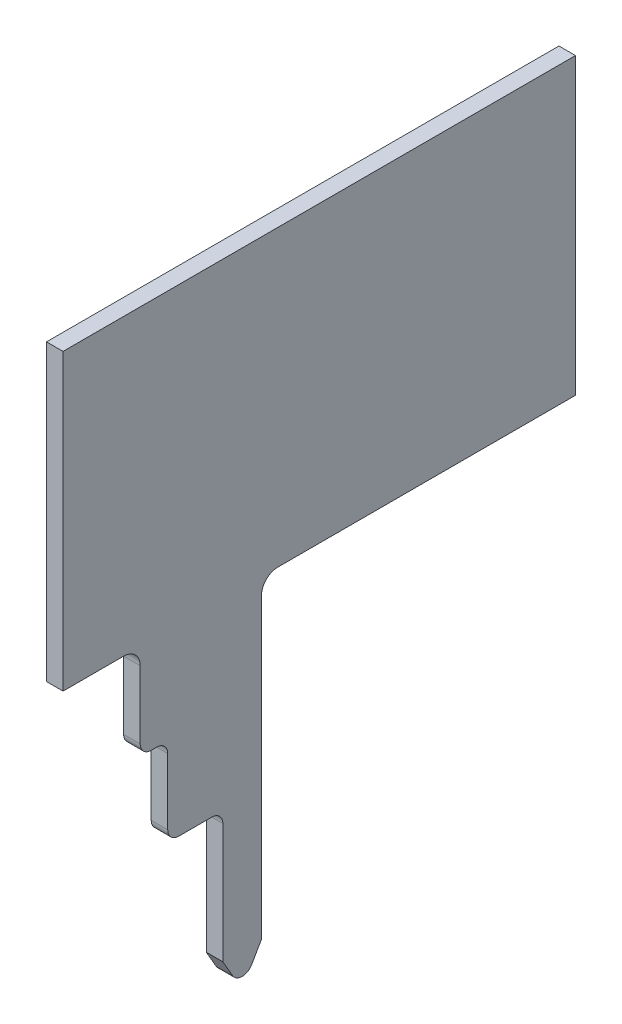
ISO-10303-21;
HEADER;
FILE_DESCRIPTION(('STEP AP214'),'2;1');
FILE_NAME('part.step','',(''),(''),'','','');
FILE_SCHEMA(('AUTOMOTIVE_DESIGN { 1 0 10303 214 1 1 1 1 }'));
ENDSEC;
DATA;
#1=APPLICATION_CONTEXT('core data for automotive mechanical design processes');
#2=APPLICATION_PROTOCOL_DEFINITION('international standard','automotive_design',2000,#1);
#3=PRODUCT_CONTEXT('',#1,'mechanical');
#4=PRODUCT('Part','Part','',(#3));
#5=PRODUCT_RELATED_PRODUCT_CATEGORY('part','',(#4));
#6=PRODUCT_DEFINITION_FORMATION('','',#4);
#7=PRODUCT_DEFINITION_CONTEXT('part definition',#1,'design');
#8=PRODUCT_DEFINITION('design','',#6,#7);
#9=PRODUCT_DEFINITION_SHAPE('','',#8);
#10=(LENGTH_UNIT() NAMED_UNIT(*) SI_UNIT(.MILLI.,.METRE.));
#11=(NAMED_UNIT(*) PLANE_ANGLE_UNIT() SI_UNIT($,.RADIAN.));
#12=(NAMED_UNIT(*) SI_UNIT($,.STERADIAN.) SOLID_ANGLE_UNIT());
#13=UNCERTAINTY_MEASURE_WITH_UNIT(LENGTH_MEASURE(1.E-05),#10,'distance_accuracy_value','');
#14=(GEOMETRIC_REPRESENTATION_CONTEXT(3) GLOBAL_UNCERTAINTY_ASSIGNED_CONTEXT((#13)) GLOBAL_UNIT_ASSIGNED_CONTEXT((#10,
#11,#12)) REPRESENTATION_CONTEXT('',''));
#15=CARTESIAN_POINT('',(0.,0.,0.));
#16=DIRECTION('',(0.,0.,1.));
#17=DIRECTION('',(1.,0.,0.));
#18=AXIS2_PLACEMENT_3D('',#15,#16,#17);
#19=CARTESIAN_POINT('',(0.85,-39.55963411247,-9.486));
#20=DIRECTION('',(-1.,0.,0.));
#21=DIRECTION('',(0.,0.,1.));
#22=AXIS2_PLACEMENT_3D('',#19,#20,#21);
#23=PLANE('',#22);
#24=CARTESIAN_POINT('',(0.85,-35.15,-1.7));
#25=DIRECTION('',(1.,0.,0.));
#26=DIRECTION('',(0.,0.,-1.));
#27=AXIS2_PLACEMENT_3D('',#24,#25,#26);
#28=CIRCLE('',#27,0.2);
#29=CARTESIAN_POINT('',(0.85,-35.15,-1.9));
#30=VERTEX_POINT('',#29);
#31=CARTESIAN_POINT('',(0.85,-34.95,-1.7));
#32=VERTEX_POINT('',#31);
#33=EDGE_CURVE('E250',#30,#32,#28,.T.);
#34=ORIENTED_EDGE('',*,*,#33,.T.);
#35=DIRECTION('',(0.,0.,-1.));
#36=VECTOR('',#35,1.);
#37=CARTESIAN_POINT('',(0.85,-34.95,-1.65));
#38=LINE('',#37,#36);
#39=CARTESIAN_POINT('',(0.85,-34.95,-1.6));
#40=VERTEX_POINT('',#39);
#41=EDGE_CURVE('E203',#32,#40,#38,.F.);
#42=ORIENTED_EDGE('',*,*,#41,.T.);
#43=CARTESIAN_POINT('',(0.85,-34.75,-1.6));
#44=DIRECTION('',(-1.,0.,0.));
#45=DIRECTION('',(0.,0.,1.));
#46=AXIS2_PLACEMENT_3D('',#43,#44,#45);
#47=CIRCLE('',#46,0.199999999999992);
#48=CARTESIAN_POINT('',(0.85,-34.75,-1.4));
#49=VERTEX_POINT('',#48);
#50=EDGE_CURVE('E248',#40,#49,#47,.T.);
#51=ORIENTED_EDGE('',*,*,#50,.T.);
#52=DIRECTION('',(0.,-1.,0.));
#53=VECTOR('',#52,1.);
#54=CARTESIAN_POINT('',(0.85,-34.135,-1.4));
#55=LINE('',#54,#53);
#56=CARTESIAN_POINT('',(0.85,-33.52,-1.4));
#57=VERTEX_POINT('',#56);
#58=EDGE_CURVE('E199',#49,#57,#55,.F.);
#59=ORIENTED_EDGE('',*,*,#58,.T.);
#60=CARTESIAN_POINT('',(0.85,-33.52,-1.1));
#61=DIRECTION('',(-1.,0.,0.));
#62=DIRECTION('',(0.,0.,1.));
#63=AXIS2_PLACEMENT_3D('',#60,#61,#62);
#64=CIRCLE('',#63,0.299999999999995);
#65=CARTESIAN_POINT('',(0.85,-33.22,-1.1));
#66=VERTEX_POINT('',#65);
#67=EDGE_CURVE('E246',#57,#66,#64,.F.);
#68=ORIENTED_EDGE('',*,*,#67,.T.);
#69=DIRECTION('',(0.,0.,-1.));
#70=VECTOR('',#69,1.);
#71=CARTESIAN_POINT('',(0.85,-33.22,-4.65));
#72=LINE('',#71,#70);
#73=CARTESIAN_POINT('',(0.85,-33.22,0.));
#74=VERTEX_POINT('',#73);
#75=EDGE_CURVE('E193',#66,#74,#72,.F.);
#76=ORIENTED_EDGE('',*,*,#75,.T.);
#77=DIRECTION('',(0.,-1.,0.));
#78=VECTOR('',#77,1.);
#79=CARTESIAN_POINT('',(0.85,-30.55,0.));
#80=LINE('',#79,#78);
#81=CARTESIAN_POINT('',(0.85,-27.88,0.));
#82=VERTEX_POINT('',#81);
#83=EDGE_CURVE('E187',#74,#82,#80,.F.);
#84=ORIENTED_EDGE('',*,*,#83,.T.);
#85=DIRECTION('',(0.,0.,1.));
#86=VECTOR('',#85,1.);
#87=CARTESIAN_POINT('',(0.85,-27.88,-4.65));
#88=LINE('',#87,#86);
#89=CARTESIAN_POINT('',(0.85,-27.88,-9.3));
#90=VERTEX_POINT('',#89);
#91=EDGE_CURVE('E181',#82,#90,#88,.F.);
#92=ORIENTED_EDGE('',*,*,#91,.T.);
#93=DIRECTION('',(0.,1.,0.));
#94=VECTOR('',#93,1.);
#95=CARTESIAN_POINT('',(0.85,-30.55,-9.3));
#96=LINE('',#95,#94);
#97=CARTESIAN_POINT('',(0.85,-33.22,-9.3));
#98=VERTEX_POINT('',#97);
#99=EDGE_CURVE('E175',#90,#98,#96,.F.);
#100=ORIENTED_EDGE('',*,*,#99,.T.);
#101=DIRECTION('',(0.,0.,-1.));
#102=VECTOR('',#101,1.);
#103=CARTESIAN_POINT('',(0.85,-33.22,-4.65));
#104=LINE('',#103,#102);
#105=CARTESIAN_POINT('',(0.85,-33.22,-3.9));
#106=VERTEX_POINT('',#105);
#107=EDGE_CURVE('E169',#98,#106,#104,.F.);
#108=ORIENTED_EDGE('',*,*,#107,.T.);
#109=CARTESIAN_POINT('',(0.85,-33.52,-3.9));
#110=DIRECTION('',(1.,0.,0.));
#111=DIRECTION('',(0.,0.,-1.));
#112=AXIS2_PLACEMENT_3D('',#109,#110,#111);
#113=CIRCLE('',#112,0.299999999999995);
#114=CARTESIAN_POINT('',(0.85,-33.52,-3.6));
#115=VERTEX_POINT('',#114);
#116=EDGE_CURVE('E166',#106,#115,#113,.T.);
#117=ORIENTED_EDGE('',*,*,#116,.T.);
#118=DIRECTION('',(0.,1.,0.));
#119=VECTOR('',#118,1.);
#120=CARTESIAN_POINT('',(0.85,-36.221891108675,-3.6));
#121=LINE('',#120,#119);
#122=CARTESIAN_POINT('',(0.85,-38.9237822173506,-3.60000000000105));
#123=VERTEX_POINT('',#122);
#124=EDGE_CURVE('E162',#115,#123,#121,.F.);
#125=ORIENTED_EDGE('',*,*,#124,.T.);
#126=DIRECTION('',(0.,0.866025403780102,-0.500000000007511));
#127=VECTOR('',#126,1.);
#128=CARTESIAN_POINT('',(0.85,-39.076891108675,-3.5116025403785));
#129=LINE('',#128,#127);
#130=CARTESIAN_POINT('',(0.85,-39.2300000000003,-3.42320508075573));
#131=VERTEX_POINT('',#130);
#132=EDGE_CURVE('E156',#123,#131,#129,.F.);
#133=ORIENTED_EDGE('',*,*,#132,.T.);
#134=CARTESIAN_POINT('',(0.85,-39.13,-3.25));
#135=DIRECTION('',(1.,0.,0.));
#136=DIRECTION('',(0.,0.,-1.));
#137=AXIS2_PLACEMENT_3D('',#134,#135,#136);
#138=CIRCLE('',#137,0.2);
#139=CARTESIAN_POINT('',(0.85,-39.2299999999999,-3.07679491924501));
#140=VERTEX_POINT('',#139);
#141=EDGE_CURVE('E242',#131,#140,#138,.F.);
#142=ORIENTED_EDGE('',*,*,#141,.T.);
#143=DIRECTION('',(0.,-0.866025403780102,-0.500000000007512));
#144=VECTOR('',#143,1.);
#145=CARTESIAN_POINT('',(0.85,-39.076891108675,-2.9883974596215));
#146=LINE('',#145,#144);
#147=CARTESIAN_POINT('',(0.85,-38.9237822173503,-2.89999999999948));
#148=VERTEX_POINT('',#147);
#149=EDGE_CURVE('E150',#140,#148,#146,.F.);
#150=ORIENTED_EDGE('',*,*,#149,.T.);
#151=DIRECTION('',(0.,-1.,0.));
#152=VECTOR('',#151,1.);
#153=CARTESIAN_POINT('',(0.85,-37.836891108675,-2.9));
#154=LINE('',#153,#152);
#155=CARTESIAN_POINT('',(0.85,-36.75,-2.9));
#156=VERTEX_POINT('',#155);
#157=EDGE_CURVE('E132',#148,#156,#154,.F.);
#158=ORIENTED_EDGE('',*,*,#157,.T.);
#159=CARTESIAN_POINT('',(0.85,-36.75,-2.7));
#160=DIRECTION('',(1.,0.,0.));
#161=DIRECTION('',(0.,0.,-1.));
#162=AXIS2_PLACEMENT_3D('',#159,#160,#161);
#163=CIRCLE('',#162,0.2);
#164=CARTESIAN_POINT('',(0.85,-36.55,-2.7));
#165=VERTEX_POINT('',#164);
#166=EDGE_CURVE('E20',#165,#156,#163,.F.);
#167=ORIENTED_EDGE('',*,*,#166,.F.);
#168=DIRECTION('',(0.,0.,1.));
#169=VECTOR('',#168,1.);
#170=CARTESIAN_POINT('',(0.85,-36.55,-4.65));
#171=LINE('',#170,#169);
#172=CARTESIAN_POINT('',(0.85,-36.55,-2.1));
#173=VERTEX_POINT('',#172);
#174=EDGE_CURVE('E128',#173,#165,#171,.F.);
#175=ORIENTED_EDGE('',*,*,#174,.F.);
#176=CARTESIAN_POINT('',(0.85,-36.35,-2.1));
#177=DIRECTION('',(-1.,0.,0.));
#178=DIRECTION('',(0.,0.,1.));
#179=AXIS2_PLACEMENT_3D('',#176,#177,#178);
#180=CIRCLE('',#179,0.200000000000006);
#181=CARTESIAN_POINT('',(0.85,-36.35,-1.9));
#182=VERTEX_POINT('',#181);
#183=EDGE_CURVE('E135',#173,#182,#180,.T.);
#184=ORIENTED_EDGE('',*,*,#183,.T.);
#185=DIRECTION('',(0.,-1.,0.));
#186=VECTOR('',#185,1.);
#187=CARTESIAN_POINT('',(0.85,-35.75,-1.9));
#188=LINE('',#187,#186);
#189=EDGE_CURVE('E207',#182,#30,#188,.F.);
#190=ORIENTED_EDGE('',*,*,#189,.T.);
#191=EDGE_LOOP('',(#34,#42,#51,#59,#68,#76,#84,#92,#100,#108,#117,#125,#133,#142,#150,#158,#167,
#175,#184,#190));
#192=FACE_BOUND('',#191,.T.);
#193=ADVANCED_FACE('F16',(#192),#23,.T.);
#194=CARTESIAN_POINT('',(1.15,-36.35,-2.1));
#195=DIRECTION('',(-1.,0.,0.));
#196=DIRECTION('',(0.,0.,1.));
#197=AXIS2_PLACEMENT_3D('',#194,#195,#196);
#198=CYLINDRICAL_SURFACE('',#197,0.200000000000006);
#199=DIRECTION('',(-1.,0.,0.));
#200=VECTOR('',#199,1.);
#201=CARTESIAN_POINT('',(0.99999999999985,-36.55,-2.1));
#202=LINE('',#201,#200);
#203=CARTESIAN_POINT('',(1.15,-36.55,-2.1));
#204=VERTEX_POINT('',#203);
#205=EDGE_CURVE('E140',#173,#204,#202,.F.);
#206=ORIENTED_EDGE('',*,*,#205,.T.);
#207=CARTESIAN_POINT('',(1.15,-36.35,-2.1));
#208=DIRECTION('',(-1.,0.,0.));
#209=DIRECTION('',(0.,0.,1.));
#210=AXIS2_PLACEMENT_3D('',#207,#208,#209);
#211=CIRCLE('',#210,0.200000000000006);
#212=CARTESIAN_POINT('',(1.15,-36.35,-1.9));
#213=VERTEX_POINT('',#212);
#214=EDGE_CURVE('E139',#204,#213,#211,.T.);
#215=ORIENTED_EDGE('',*,*,#214,.T.);
#216=DIRECTION('',(1.,0.,0.));
#217=VECTOR('',#216,1.);
#218=CARTESIAN_POINT('',(0.99999999999985,-36.35,-1.9));
#219=LINE('',#218,#217);
#220=EDGE_CURVE('E210',#213,#182,#219,.F.);
#221=ORIENTED_EDGE('',*,*,#220,.T.);
#222=ORIENTED_EDGE('',*,*,#183,.F.);
#223=EDGE_LOOP('',(#206,#215,#221,#222));
#224=FACE_BOUND('',#223,.T.);
#225=ADVANCED_FACE('F337',(#224),#198,.T.);
#226=CARTESIAN_POINT('',(0.8322945403607,-35.126,-1.9));
#227=DIRECTION('',(0.,0.,1.));
#228=DIRECTION('',(0.,-1.,0.));
#229=AXIS2_PLACEMENT_3D('',#226,#227,#228);
#230=PLANE('',#229);
#231=DIRECTION('',(1.,0.,0.));
#232=VECTOR('',#231,1.);
#233=CARTESIAN_POINT('',(0.99999999999985,-35.15,-1.9));
#234=LINE('',#233,#232);
#235=CARTESIAN_POINT('',(1.15,-35.15,-1.9));
#236=VERTEX_POINT('',#235);
#237=EDGE_CURVE('E209',#236,#30,#234,.F.);
#238=ORIENTED_EDGE('',*,*,#237,.T.);
#239=ORIENTED_EDGE('',*,*,#189,.F.);
#240=ORIENTED_EDGE('',*,*,#220,.F.);
#241=DIRECTION('',(0.,1.,0.));
#242=VECTOR('',#241,1.);
#243=CARTESIAN_POINT('',(1.15,-33.605310839445,-1.9));
#244=LINE('',#243,#242);
#245=EDGE_CURVE('E239',#213,#236,#244,.T.);
#246=ORIENTED_EDGE('',*,*,#245,.T.);
#247=EDGE_LOOP('',(#238,#239,#240,#246));
#248=FACE_BOUND('',#247,.T.);
#249=ADVANCED_FACE('F341',(#248),#230,.T.);
#250=CARTESIAN_POINT('',(0.85,-35.15,-1.7));
#251=DIRECTION('',(1.,0.,0.));
#252=DIRECTION('',(0.,0.,-1.));
#253=AXIS2_PLACEMENT_3D('',#250,#251,#252);
#254=CYLINDRICAL_SURFACE('',#253,0.2);
#255=DIRECTION('',(1.,0.,0.));
#256=VECTOR('',#255,1.);
#257=CARTESIAN_POINT('',(0.99999999999985,-34.95,-1.7));
#258=LINE('',#257,#256);
#259=CARTESIAN_POINT('',(1.15,-34.95,-1.7));
#260=VERTEX_POINT('',#259);
#261=EDGE_CURVE('E206',#260,#32,#258,.F.);
#262=ORIENTED_EDGE('',*,*,#261,.T.);
#263=ORIENTED_EDGE('',*,*,#33,.F.);
#264=ORIENTED_EDGE('',*,*,#237,.F.);
#265=CARTESIAN_POINT('',(1.15,-35.15,-1.7));
#266=DIRECTION('',(1.,0.,0.));
#267=DIRECTION('',(0.,0.,-1.));
#268=AXIS2_PLACEMENT_3D('',#265,#266,#267);
#269=CIRCLE('',#268,0.2);
#270=EDGE_CURVE('E236',#236,#260,#269,.T.);
#271=ORIENTED_EDGE('',*,*,#270,.T.);
#272=EDGE_LOOP('',(#262,#263,#264,#271));
#273=FACE_BOUND('',#272,.T.);
#274=ADVANCED_FACE('F320',(#273),#254,.F.);
#275=CARTESIAN_POINT('',(0.8322945403607,-34.95,-1.582294540361));
#276=DIRECTION('',(0.,-1.,0.));
#277=DIRECTION('',(0.,0.,-1.));
#278=AXIS2_PLACEMENT_3D('',#275,#276,#277);
#279=PLANE('',#278);
#280=ORIENTED_EDGE('',*,*,#261,.F.);
#281=DIRECTION('',(0.,0.,1.));
#282=VECTOR('',#281,1.);
#283=CARTESIAN_POINT('',(1.15,-34.95,-4.65));
#284=LINE('',#283,#282);
#285=CARTESIAN_POINT('',(1.15,-34.95,-1.6));
#286=VERTEX_POINT('',#285);
#287=EDGE_CURVE('E235',#260,#286,#284,.T.);
#288=ORIENTED_EDGE('',*,*,#287,.T.);
#289=DIRECTION('',(-1.,0.,0.));
#290=VECTOR('',#289,1.);
#291=CARTESIAN_POINT('',(0.99999999999985,-34.95,-1.6));
#292=LINE('',#291,#290);
#293=EDGE_CURVE('E205',#286,#40,#292,.T.);
#294=ORIENTED_EDGE('',*,*,#293,.T.);
#295=ORIENTED_EDGE('',*,*,#41,.F.);
#296=EDGE_LOOP('',(#280,#288,#294,#295));
#297=FACE_BOUND('',#296,.T.);
#298=ADVANCED_FACE('F327',(#297),#279,.T.);
#299=CARTESIAN_POINT('',(1.15,-34.75,-1.6));
#300=DIRECTION('',(-1.,0.,0.));
#301=DIRECTION('',(0.,0.,1.));
#302=AXIS2_PLACEMENT_3D('',#299,#300,#301);
#303=CYLINDRICAL_SURFACE('',#302,0.199999999999992);
#304=ORIENTED_EDGE('',*,*,#293,.F.);
#305=CARTESIAN_POINT('',(1.15,-34.75,-1.6));
#306=DIRECTION('',(-1.,0.,0.));
#307=DIRECTION('',(0.,0.,1.));
#308=AXIS2_PLACEMENT_3D('',#305,#306,#307);
#309=CIRCLE('',#308,0.199999999999992);
#310=CARTESIAN_POINT('',(1.15,-34.75,-1.4));
#311=VERTEX_POINT('',#310);
#312=EDGE_CURVE('E232',#286,#311,#309,.T.);
#313=ORIENTED_EDGE('',*,*,#312,.T.);
#314=DIRECTION('',(1.,0.,0.));
#315=VECTOR('',#314,1.);
#316=CARTESIAN_POINT('',(0.99999999999985,-34.75,-1.4));
#317=LINE('',#316,#315);
#318=EDGE_CURVE('E202',#311,#49,#317,.F.);
#319=ORIENTED_EDGE('',*,*,#318,.T.);
#320=ORIENTED_EDGE('',*,*,#50,.F.);
#321=EDGE_LOOP('',(#304,#313,#319,#320));
#322=FACE_BOUND('',#321,.T.);
#323=ADVANCED_FACE('F345',(#322),#303,.T.);
#324=CARTESIAN_POINT('',(0.8322945403607,-33.4954,-1.4));
#325=DIRECTION('',(0.,0.,1.));
#326=DIRECTION('',(0.,-1.,0.));
#327=AXIS2_PLACEMENT_3D('',#324,#325,#326);
#328=PLANE('',#327);
#329=DIRECTION('',(1.,0.,0.));
#330=VECTOR('',#329,1.);
#331=CARTESIAN_POINT('',(0.99999999999985,-33.52,-1.39999999999999));
#332=LINE('',#331,#330);
#333=CARTESIAN_POINT('',(1.15,-33.52,-1.4));
#334=VERTEX_POINT('',#333);
#335=EDGE_CURVE('E201',#334,#57,#332,.F.);
#336=ORIENTED_EDGE('',*,*,#335,.T.);
#337=ORIENTED_EDGE('',*,*,#58,.F.);
#338=ORIENTED_EDGE('',*,*,#318,.F.);
#339=DIRECTION('',(0.,1.,0.));
#340=VECTOR('',#339,1.);
#341=CARTESIAN_POINT('',(1.15,-33.605310839445,-1.4));
#342=LINE('',#341,#340);
#343=EDGE_CURVE('E231',#311,#334,#342,.T.);
#344=ORIENTED_EDGE('',*,*,#343,.T.);
#345=EDGE_LOOP('',(#336,#337,#338,#344));
#346=FACE_BOUND('',#345,.T.);
#347=ADVANCED_FACE('F348',(#346),#328,.T.);
#348=CARTESIAN_POINT('',(1.15,-33.52,-1.1));
#349=DIRECTION('',(-1.,0.,0.));
#350=DIRECTION('',(0.,0.,1.));
#351=AXIS2_PLACEMENT_3D('',#348,#349,#350);
#352=CYLINDRICAL_SURFACE('',#351,0.299999999999995);
#353=ORIENTED_EDGE('',*,*,#335,.F.);
#354=CARTESIAN_POINT('',(1.15,-33.52,-1.1));
#355=DIRECTION('',(-1.,0.,0.));
#356=DIRECTION('',(0.,0.,1.));
#357=AXIS2_PLACEMENT_3D('',#354,#355,#356);
#358=CIRCLE('',#357,0.299999999999995);
#359=CARTESIAN_POINT('',(1.15,-33.22,-1.1));
#360=VERTEX_POINT('',#359);
#361=EDGE_CURVE('E227',#334,#360,#358,.F.);
#362=ORIENTED_EDGE('',*,*,#361,.T.);
#363=DIRECTION('',(1.,0.,0.));
#364=VECTOR('',#363,1.);
#365=CARTESIAN_POINT('',(0.99999999999985,-33.22,-1.1));
#366=LINE('',#365,#364);
#367=EDGE_CURVE('E196',#360,#66,#366,.F.);
#368=ORIENTED_EDGE('',*,*,#367,.T.);
#369=ORIENTED_EDGE('',*,*,#67,.F.);
#370=EDGE_LOOP('',(#353,#362,#368,#369));
#371=FACE_BOUND('',#370,.T.);
#372=ADVANCED_FACE('F354',(#371),#352,.F.);
#373=CARTESIAN_POINT('',(1.167705459639,-33.22,-9.486));
#374=DIRECTION('',(0.,-1.,0.));
#375=DIRECTION('',(0.,0.,1.));
#376=AXIS2_PLACEMENT_3D('',#373,#374,#375);
#377=PLANE('',#376);
#378=DIRECTION('',(1.,0.,0.));
#379=VECTOR('',#378,1.);
#380=CARTESIAN_POINT('',(0.99999999999985,-33.22,0.));
#381=LINE('',#380,#379);
#382=CARTESIAN_POINT('',(1.15,-33.22,0.));
#383=VERTEX_POINT('',#382);
#384=EDGE_CURVE('E190',#383,#74,#381,.F.);
#385=ORIENTED_EDGE('',*,*,#384,.T.);
#386=ORIENTED_EDGE('',*,*,#75,.F.);
#387=ORIENTED_EDGE('',*,*,#367,.F.);
#388=DIRECTION('',(0.,0.,1.));
#389=VECTOR('',#388,1.);
#390=CARTESIAN_POINT('',(1.15,-33.22,-4.65));
#391=LINE('',#390,#389);
#392=EDGE_CURVE('E230',#360,#383,#391,.T.);
#393=ORIENTED_EDGE('',*,*,#392,.T.);
#394=EDGE_LOOP('',(#385,#386,#387,#393));
#395=FACE_BOUND('',#394,.T.);
#396=ADVANCED_FACE('F359',(#395),#377,.T.);
#397=CARTESIAN_POINT('',(1.167705459639,-33.3268,0.));
#398=DIRECTION('',(0.,0.,1.));
#399=DIRECTION('',(0.,1.,0.));
#400=AXIS2_PLACEMENT_3D('',#397,#398,#399);
#401=PLANE('',#400);
#402=ORIENTED_EDGE('',*,*,#83,.F.);
#403=ORIENTED_EDGE('',*,*,#384,.F.);
#404=DIRECTION('',(0.,1.,0.));
#405=VECTOR('',#404,1.);
#406=CARTESIAN_POINT('',(1.15,-33.605310839445,0.));
#407=LINE('',#406,#405);
#408=CARTESIAN_POINT('',(1.15,-27.88,0.));
#409=VERTEX_POINT('',#408);
#410=EDGE_CURVE('E295',#383,#409,#407,.T.);
#411=ORIENTED_EDGE('',*,*,#410,.T.);
#412=DIRECTION('',(1.,0.,0.));
#413=VECTOR('',#412,1.);
#414=CARTESIAN_POINT('',(0.99999999999985,-27.88,0.));
#415=LINE('',#414,#413);
#416=EDGE_CURVE('E184',#409,#82,#415,.F.);
#417=ORIENTED_EDGE('',*,*,#416,.T.);
#418=EDGE_LOOP('',(#402,#403,#411,#417));
#419=FACE_BOUND('',#418,.T.);
#420=ADVANCED_FACE('F363',(#419),#401,.T.);
#421=CARTESIAN_POINT('',(1.167705459639,-27.88,0.186));
#422=DIRECTION('',(0.,1.,0.));
#423=DIRECTION('',(0.,0.,-1.));
#424=AXIS2_PLACEMENT_3D('',#421,#422,#423);
#425=PLANE('',#424);
#426=ORIENTED_EDGE('',*,*,#91,.F.);
#427=ORIENTED_EDGE('',*,*,#416,.F.);
#428=DIRECTION('',(0.,0.,-1.));
#429=VECTOR('',#428,1.);
#430=CARTESIAN_POINT('',(1.15,-27.88,-4.65));
#431=LINE('',#430,#429);
#432=CARTESIAN_POINT('',(1.15,-27.88,-9.3));
#433=VERTEX_POINT('',#432);
#434=EDGE_CURVE('E286',#409,#433,#431,.T.);
#435=ORIENTED_EDGE('',*,*,#434,.T.);
#436=DIRECTION('',(1.,0.,0.));
#437=VECTOR('',#436,1.);
#438=CARTESIAN_POINT('',(0.99999999999985,-27.88,-9.3));
#439=LINE('',#438,#437);
#440=EDGE_CURVE('E178',#433,#90,#439,.F.);
#441=ORIENTED_EDGE('',*,*,#440,.T.);
#442=EDGE_LOOP('',(#426,#427,#435,#441));
#443=FACE_BOUND('',#442,.T.);
#444=ADVANCED_FACE('F374',(#443),#425,.T.);
#445=CARTESIAN_POINT('',(1.167705459639,-27.7732,-9.3));
#446=DIRECTION('',(0.,0.,-1.));
#447=DIRECTION('',(0.,-1.,0.));
#448=AXIS2_PLACEMENT_3D('',#445,#446,#447);
#449=PLANE('',#448);
#450=ORIENTED_EDGE('',*,*,#99,.F.);
#451=ORIENTED_EDGE('',*,*,#440,.F.);
#452=DIRECTION('',(0.,-1.,0.));
#453=VECTOR('',#452,1.);
#454=CARTESIAN_POINT('',(1.15,-33.605310839445,-9.3));
#455=LINE('',#454,#453);
#456=CARTESIAN_POINT('',(1.15,-33.22,-9.3));
#457=VERTEX_POINT('',#456);
#458=EDGE_CURVE('E283',#433,#457,#455,.T.);
#459=ORIENTED_EDGE('',*,*,#458,.T.);
#460=DIRECTION('',(1.,0.,0.));
#461=VECTOR('',#460,1.);
#462=CARTESIAN_POINT('',(0.99999999999985,-33.22,-9.3));
#463=LINE('',#462,#461);
#464=EDGE_CURVE('E172',#457,#98,#463,.F.);
#465=ORIENTED_EDGE('',*,*,#464,.T.);
#466=EDGE_LOOP('',(#450,#451,#459,#465));
#467=FACE_BOUND('',#466,.T.);
#468=ADVANCED_FACE('F386',(#467),#449,.T.);
#469=CARTESIAN_POINT('',(1.167705459639,-33.22,-9.486));
#470=DIRECTION('',(0.,-1.,0.));
#471=DIRECTION('',(0.,0.,1.));
#472=AXIS2_PLACEMENT_3D('',#469,#470,#471);
#473=PLANE('',#472);
#474=ORIENTED_EDGE('',*,*,#464,.F.);
#475=DIRECTION('',(0.,0.,1.));
#476=VECTOR('',#475,1.);
#477=CARTESIAN_POINT('',(1.15,-33.22,-4.65));
#478=LINE('',#477,#476);
#479=CARTESIAN_POINT('',(1.15,-33.22,-3.9));
#480=VERTEX_POINT('',#479);
#481=EDGE_CURVE('E226',#457,#480,#478,.T.);
#482=ORIENTED_EDGE('',*,*,#481,.T.);
#483=DIRECTION('',(1.,0.,0.));
#484=VECTOR('',#483,1.);
#485=CARTESIAN_POINT('',(0.99999999999985,-33.22,-3.9));
#486=LINE('',#485,#484);
#487=EDGE_CURVE('E171',#480,#106,#486,.F.);
#488=ORIENTED_EDGE('',*,*,#487,.T.);
#489=ORIENTED_EDGE('',*,*,#107,.F.);
#490=EDGE_LOOP('',(#474,#482,#488,#489));
#491=FACE_BOUND('',#490,.T.);
#492=ADVANCED_FACE('F389',(#491),#473,.T.);
#493=CARTESIAN_POINT('',(0.85,-33.52,-3.9));
#494=DIRECTION('',(1.,0.,0.));
#495=DIRECTION('',(0.,0.,-1.));
#496=AXIS2_PLACEMENT_3D('',#493,#494,#495);
#497=CYLINDRICAL_SURFACE('',#496,0.299999999999995);
#498=DIRECTION('',(1.,0.,0.));
#499=VECTOR('',#498,1.);
#500=CARTESIAN_POINT('',(0.99999999999985,-33.52,-3.6));
#501=LINE('',#500,#499);
#502=CARTESIAN_POINT('',(1.15,-33.52,-3.6));
#503=VERTEX_POINT('',#502);
#504=EDGE_CURVE('E165',#503,#115,#501,.F.);
#505=ORIENTED_EDGE('',*,*,#504,.T.);
#506=ORIENTED_EDGE('',*,*,#116,.F.);
#507=ORIENTED_EDGE('',*,*,#487,.F.);
#508=CARTESIAN_POINT('',(1.15,-33.52,-3.9));
#509=DIRECTION('',(1.,0.,0.));
#510=DIRECTION('',(0.,0.,-1.));
#511=AXIS2_PLACEMENT_3D('',#508,#509,#510);
#512=CIRCLE('',#511,0.299999999999995);
#513=EDGE_CURVE('E223',#480,#503,#512,.T.);
#514=ORIENTED_EDGE('',*,*,#513,.T.);
#515=EDGE_LOOP('',(#505,#506,#507,#514));
#516=FACE_BOUND('',#515,.T.);
#517=ADVANCED_FACE('F418',(#516),#497,.F.);
#518=CARTESIAN_POINT('',(0.8322945403607,-39.0318578617,-3.6));
#519=DIRECTION('',(0.,0.,-1.));
#520=DIRECTION('',(0.,1.,0.));
#521=AXIS2_PLACEMENT_3D('',#518,#519,#520);
#522=PLANE('',#521);
#523=DIRECTION('',(0.,-1.,0.));
#524=VECTOR('',#523,1.);
#525=CARTESIAN_POINT('',(1.15,-33.605310839445,-3.6));
#526=LINE('',#525,#524);
#527=CARTESIAN_POINT('',(1.15,-38.9237822173523,-3.60000000000078));
#528=VERTEX_POINT('',#527);
#529=EDGE_CURVE('E222',#503,#528,#526,.T.);
#530=ORIENTED_EDGE('',*,*,#529,.T.);
#531=DIRECTION('',(1.,0.,0.));
#532=VECTOR('',#531,1.);
#533=CARTESIAN_POINT('',(0.99999999999985,-38.9237822173509,-3.60000000000157));
#534=LINE('',#533,#532);
#535=EDGE_CURVE('E159',#528,#123,#534,.F.);
#536=ORIENTED_EDGE('',*,*,#535,.T.);
#537=ORIENTED_EDGE('',*,*,#124,.F.);
#538=ORIENTED_EDGE('',*,*,#504,.F.);
#539=EDGE_LOOP('',(#530,#536,#537,#538));
#540=FACE_BOUND('',#539,.T.);
#541=ADVANCED_FACE('F413',(#540),#522,.T.);
#542=CARTESIAN_POINT('',(0.8322945403607,-39.24533337783,-3.414352350937));
#543=DIRECTION('',(0.,-0.500000000007512,-0.866025403780102));
#544=DIRECTION('',(0.,0.866025403780102,-0.500000000007512));
#545=AXIS2_PLACEMENT_3D('',#542,#543,#544);
#546=PLANE('',#545);
#547=ORIENTED_EDGE('',*,*,#132,.F.);
#548=ORIENTED_EDGE('',*,*,#535,.F.);
#549=DIRECTION('',(0.,0.866025403780102,-0.500000000007512));
#550=VECTOR('',#549,1.);
#551=CARTESIAN_POINT('',(1.15,-39.24533337783,-3.414352350937));
#552=LINE('',#551,#550);
#553=CARTESIAN_POINT('',(1.15,-39.2300000000003,-3.42320508075573));
#554=VERTEX_POINT('',#553);
#555=EDGE_CURVE('E219',#528,#554,#552,.F.);
#556=ORIENTED_EDGE('',*,*,#555,.T.);
#557=DIRECTION('',(-1.,0.,0.));
#558=VECTOR('',#557,1.);
#559=CARTESIAN_POINT('',(0.99999999999985,-39.23,-3.42320508075691));
#560=LINE('',#559,#558);
#561=EDGE_CURVE('E158',#554,#131,#560,.T.);
#562=ORIENTED_EDGE('',*,*,#561,.T.);
#563=EDGE_LOOP('',(#547,#548,#556,#562));
#564=FACE_BOUND('',#563,.T.);
#565=ADVANCED_FACE('F411',(#564),#546,.T.);
#566=CARTESIAN_POINT('',(0.85,-39.13,-3.25));
#567=DIRECTION('',(1.,0.,0.));
#568=DIRECTION('',(0.,0.,-1.));
#569=AXIS2_PLACEMENT_3D('',#566,#567,#568);
#570=CYLINDRICAL_SURFACE('',#569,0.2);
#571=ORIENTED_EDGE('',*,*,#141,.F.);
#572=ORIENTED_EDGE('',*,*,#561,.F.);
#573=CARTESIAN_POINT('',(1.15,-39.13,-3.25));
#574=DIRECTION('',(1.,0.,0.));
#575=DIRECTION('',(0.,0.,-1.));
#576=AXIS2_PLACEMENT_3D('',#573,#574,#575);
#577=CIRCLE('',#576,0.2);
#578=CARTESIAN_POINT('',(1.15,-39.2299999999999,-3.07679491924501));
#579=VERTEX_POINT('',#578);
#580=EDGE_CURVE('E216',#554,#579,#577,.F.);
#581=ORIENTED_EDGE('',*,*,#580,.T.);
#582=DIRECTION('',(1.,0.,0.));
#583=VECTOR('',#582,1.);
#584=CARTESIAN_POINT('',(0.99999999999985,-39.2299999999991,-3.07679491924457));
#585=LINE('',#584,#583);
#586=EDGE_CURVE('E153',#579,#140,#585,.F.);
#587=ORIENTED_EDGE('',*,*,#586,.T.);
#588=EDGE_LOOP('',(#571,#572,#581,#587));
#589=FACE_BOUND('',#588,.T.);
#590=ADVANCED_FACE('F407',(#589),#570,.T.);
#591=CARTESIAN_POINT('',(0.8322945403607,-38.90844883952,-2.89114727018));
#592=DIRECTION('',(0.,-0.500000000007512,0.866025403780102));
#593=DIRECTION('',(0.,-0.866025403780102,-0.500000000007512));
#594=AXIS2_PLACEMENT_3D('',#591,#592,#593);
#595=PLANE('',#594);
#596=ORIENTED_EDGE('',*,*,#149,.F.);
#597=ORIENTED_EDGE('',*,*,#586,.F.);
#598=DIRECTION('',(0.,-0.866025403780102,-0.500000000007512));
#599=VECTOR('',#598,1.);
#600=CARTESIAN_POINT('',(1.15,-38.90844883952,-2.89114727018));
#601=LINE('',#600,#599);
#602=CARTESIAN_POINT('',(1.15,-38.9237822173518,-2.9));
#603=VERTEX_POINT('',#602);
#604=EDGE_CURVE('E213',#579,#603,#601,.F.);
#605=ORIENTED_EDGE('',*,*,#604,.T.);
#606=DIRECTION('',(1.,0.,0.));
#607=VECTOR('',#606,1.);
#608=CARTESIAN_POINT('',(0.99999999999985,-38.92378221735,-2.9));
#609=LINE('',#608,#607);
#610=EDGE_CURVE('E152',#603,#148,#609,.F.);
#611=ORIENTED_EDGE('',*,*,#610,.T.);
#612=EDGE_LOOP('',(#596,#597,#605,#611));
#613=FACE_BOUND('',#612,.T.);
#614=ADVANCED_FACE('F404',(#613),#595,.T.);
#615=CARTESIAN_POINT('',(0.8322945403607,-36.70652435565,-2.9));
#616=DIRECTION('',(0.,0.,1.));
#617=DIRECTION('',(0.,-1.,0.));
#618=AXIS2_PLACEMENT_3D('',#615,#616,#617);
#619=PLANE('',#618);
#620=ORIENTED_EDGE('',*,*,#610,.F.);
#621=DIRECTION('',(0.,1.,0.));
#622=VECTOR('',#621,1.);
#623=CARTESIAN_POINT('',(1.15,-33.605310839445,-2.9));
#624=LINE('',#623,#622);
#625=CARTESIAN_POINT('',(1.15,-36.75,-2.9));
#626=VERTEX_POINT('',#625);
#627=EDGE_CURVE('E212',#603,#626,#624,.T.);
#628=ORIENTED_EDGE('',*,*,#627,.T.);
#629=DIRECTION('',(1.,0.,0.));
#630=VECTOR('',#629,1.);
#631=CARTESIAN_POINT('',(0.99999999999985,-36.75,-2.9));
#632=LINE('',#631,#630);
#633=EDGE_CURVE('E257',#626,#156,#632,.F.);
#634=ORIENTED_EDGE('',*,*,#633,.T.);
#635=ORIENTED_EDGE('',*,*,#157,.F.);
#636=EDGE_LOOP('',(#620,#628,#634,#635));
#637=FACE_BOUND('',#636,.T.);
#638=ADVANCED_FACE('F401',(#637),#619,.T.);
#639=CARTESIAN_POINT('',(0.85,-36.75,-2.7));
#640=DIRECTION('',(1.,0.,0.));
#641=DIRECTION('',(0.,0.,-1.));
#642=AXIS2_PLACEMENT_3D('',#639,#640,#641);
#643=CYLINDRICAL_SURFACE('',#642,0.2);
#644=DIRECTION('',(1.,0.,0.));
#645=VECTOR('',#644,1.);
#646=CARTESIAN_POINT('',(0.99999999999985,-36.55,-2.7));
#647=LINE('',#646,#645);
#648=CARTESIAN_POINT('',(1.15,-36.55,-2.7));
#649=VERTEX_POINT('',#648);
#650=EDGE_CURVE('E34',#649,#165,#647,.F.);
#651=ORIENTED_EDGE('',*,*,#650,.T.);
#652=ORIENTED_EDGE('',*,*,#166,.T.);
#653=ORIENTED_EDGE('',*,*,#633,.F.);
#654=CARTESIAN_POINT('',(1.15,-36.75,-2.7));
#655=DIRECTION('',(1.,0.,0.));
#656=DIRECTION('',(0.,0.,-1.));
#657=AXIS2_PLACEMENT_3D('',#654,#655,#656);
#658=CIRCLE('',#657,0.2);
#659=EDGE_CURVE('E26',#626,#649,#658,.T.);
#660=ORIENTED_EDGE('',*,*,#659,.T.);
#661=EDGE_LOOP('',(#651,#652,#653,#660));
#662=FACE_BOUND('',#661,.T.);
#663=ADVANCED_FACE('F137',(#662),#643,.F.);
#664=CARTESIAN_POINT('',(0.8322945403607,-36.55,-2.082294540361));
#665=DIRECTION('',(0.,-1.,0.));
#666=DIRECTION('',(0.,0.,-1.));
#667=AXIS2_PLACEMENT_3D('',#664,#665,#666);
#668=PLANE('',#667);
#669=ORIENTED_EDGE('',*,*,#650,.F.);
#670=DIRECTION('',(0.,0.,1.));
#671=VECTOR('',#670,1.);
#672=CARTESIAN_POINT('',(1.15,-36.55,-4.65));
#673=LINE('',#672,#671);
#674=EDGE_CURVE('E11',#649,#204,#673,.T.);
#675=ORIENTED_EDGE('',*,*,#674,.T.);
#676=ORIENTED_EDGE('',*,*,#205,.F.);
#677=ORIENTED_EDGE('',*,*,#174,.T.);
#678=EDGE_LOOP('',(#669,#675,#676,#677));
#679=FACE_BOUND('',#678,.T.);
#680=ADVANCED_FACE('F143',(#679),#668,.T.);
#681=CARTESIAN_POINT('',(1.15,-39.55963411247,-9.486));
#682=DIRECTION('',(-1.,0.,0.));
#683=DIRECTION('',(0.,0.,1.));
#684=AXIS2_PLACEMENT_3D('',#681,#682,#683);
#685=PLANE('',#684);
#686=ORIENTED_EDGE('',*,*,#659,.F.);
#687=ORIENTED_EDGE('',*,*,#627,.F.);
#688=ORIENTED_EDGE('',*,*,#604,.F.);
#689=ORIENTED_EDGE('',*,*,#580,.F.);
#690=ORIENTED_EDGE('',*,*,#555,.F.);
#691=ORIENTED_EDGE('',*,*,#529,.F.);
#692=ORIENTED_EDGE('',*,*,#513,.F.);
#693=ORIENTED_EDGE('',*,*,#481,.F.);
#694=ORIENTED_EDGE('',*,*,#458,.F.);
#695=ORIENTED_EDGE('',*,*,#434,.F.);
#696=ORIENTED_EDGE('',*,*,#410,.F.);
#697=ORIENTED_EDGE('',*,*,#392,.F.);
#698=ORIENTED_EDGE('',*,*,#361,.F.);
#699=ORIENTED_EDGE('',*,*,#343,.F.);
#700=ORIENTED_EDGE('',*,*,#312,.F.);
#701=ORIENTED_EDGE('',*,*,#287,.F.);
#702=ORIENTED_EDGE('',*,*,#270,.F.);
#703=ORIENTED_EDGE('',*,*,#245,.F.);
#704=ORIENTED_EDGE('',*,*,#214,.F.);
#705=ORIENTED_EDGE('',*,*,#674,.F.);
#706=EDGE_LOOP('',(#686,#687,#688,#689,#690,#691,#692,#693,#694,#695,#696,#697,#698,#699,#700,
#701,#702,#703,#704,#705));
#707=FACE_BOUND('',#706,.T.);
#708=ADVANCED_FACE('F18',(#707),#685,.F.);
#709=CLOSED_SHELL('',(#193,#225,#249,#274,#298,#323,#347,#372,#396,#420,#444,#468,#492,#517,
#541,#565,#590,#614,#638,#663,#680,#708));
#710=MANIFOLD_SOLID_BREP('B1',#709);
#711=ADVANCED_BREP_SHAPE_REPRESENTATION('',(#18,#710),#14);
#712=SHAPE_DEFINITION_REPRESENTATION(#9,#711);
ENDSEC;
END-ISO-10303-21;
